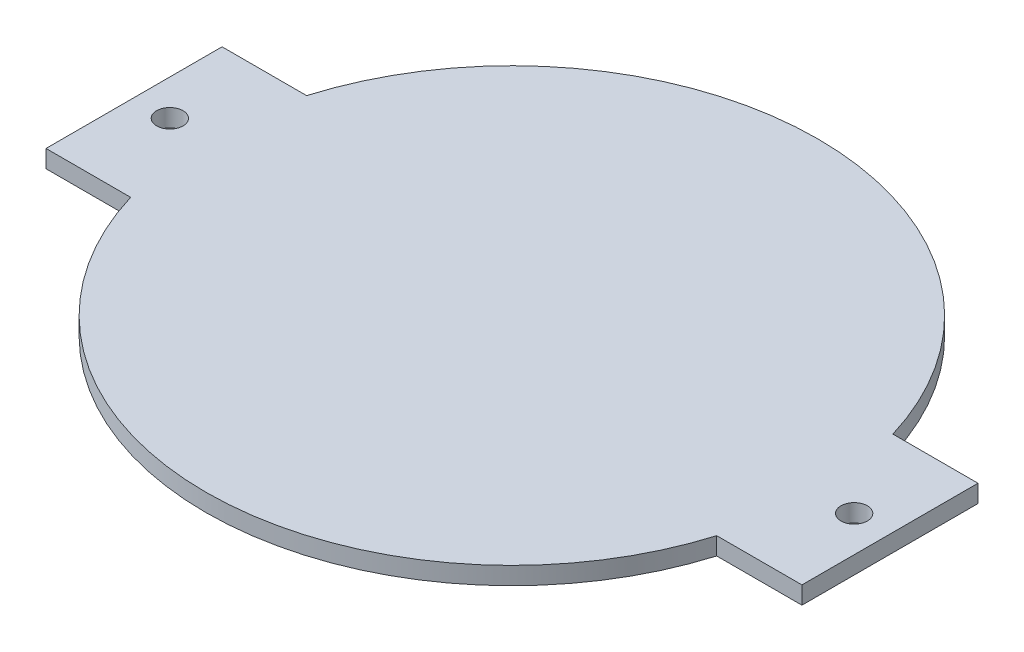
ISO-10303-21;
HEADER;
FILE_DESCRIPTION(('STEP AP214'),'2;1');
FILE_NAME('part.step','',(''),(''),'','','');
FILE_SCHEMA(('AUTOMOTIVE_DESIGN { 1 0 10303 214 1 1 1 1 }'));
ENDSEC;
DATA;
#1=APPLICATION_CONTEXT('core data for automotive mechanical design processes');
#2=APPLICATION_PROTOCOL_DEFINITION('international standard','automotive_design',2000,#1);
#3=PRODUCT_CONTEXT('',#1,'mechanical');
#4=PRODUCT('Part','Part','',(#3));
#5=PRODUCT_RELATED_PRODUCT_CATEGORY('part','',(#4));
#6=PRODUCT_DEFINITION_FORMATION('','',#4);
#7=PRODUCT_DEFINITION_CONTEXT('part definition',#1,'design');
#8=PRODUCT_DEFINITION('design','',#6,#7);
#9=PRODUCT_DEFINITION_SHAPE('','',#8);
#10=(LENGTH_UNIT() NAMED_UNIT(*) SI_UNIT(.MILLI.,.METRE.));
#11=(NAMED_UNIT(*) PLANE_ANGLE_UNIT() SI_UNIT($,.RADIAN.));
#12=(NAMED_UNIT(*) SI_UNIT($,.STERADIAN.) SOLID_ANGLE_UNIT());
#13=UNCERTAINTY_MEASURE_WITH_UNIT(LENGTH_MEASURE(1.E-05),#10,'distance_accuracy_value','');
#14=(GEOMETRIC_REPRESENTATION_CONTEXT(3) GLOBAL_UNCERTAINTY_ASSIGNED_CONTEXT((#13)) GLOBAL_UNIT_ASSIGNED_CONTEXT((#10,
#11,#12)) REPRESENTATION_CONTEXT('',''));
#15=CARTESIAN_POINT('',(0.,0.,0.));
#16=DIRECTION('',(0.,0.,1.));
#17=DIRECTION('',(1.,0.,0.));
#18=AXIS2_PLACEMENT_3D('',#15,#16,#17);
#19=CARTESIAN_POINT('',(-45.6397244959171,1.,1.53906899049078));
#20=DIRECTION('',(0.,1.,0.));
#21=DIRECTION('',(0.,0.,1.));
#22=AXIS2_PLACEMENT_3D('',#19,#20,#21);
#23=PLANE('',#22);
#24=CARTESIAN_POINT('',(-65.0556207330707,1.,1.54913489621494));
#25=DIRECTION('',(0.,1.,0.));
#26=DIRECTION('',(0.,0.,1.));
#27=AXIS2_PLACEMENT_3D('',#24,#25,#26);
#28=CIRCLE('',#27,0.750000000000009);
#29=CARTESIAN_POINT('',(-65.0556207330707,1.,2.29913489621495));
#30=VERTEX_POINT('',#29);
#31=EDGE_CURVE('E135',#30,#30,#28,.T.);
#32=ORIENTED_EDGE('',*,*,#31,.F.);
#33=EDGE_LOOP('',(#32));
#34=FACE_BOUND('',#33,.T.);
#35=DIRECTION('',(-1.,0.,0.));
#36=VECTOR('',#35,1.);
#37=CARTESIAN_POINT('',(-24.1541207330696,1.,-3.45086510379691));
#38=LINE('',#37,#36);
#39=CARTESIAN_POINT('',(-24.1541207330696,1.,-3.45086510379691));
#40=VERTEX_POINT('',#39);
#41=CARTESIAN_POINT('',(-28.98999498197,1.,-3.4508651037969));
#42=VERTEX_POINT('',#41);
#43=EDGE_CURVE('E146',#40,#42,#38,.T.);
#44=ORIENTED_EDGE('',*,*,#43,.T.);
#45=CARTESIAN_POINT('',(-45.6397244959171,1.,1.53906899049078));
#46=DIRECTION('',(0.,1.,0.));
#47=DIRECTION('',(0.,0.,1.));
#48=AXIS2_PLACEMENT_3D('',#45,#46,#47);
#49=CIRCLE('',#48,17.3813962371536);
#50=CARTESIAN_POINT('',(-62.2894540098678,1.,-3.45086510378506));
#51=VERTEX_POINT('',#50);
#52=EDGE_CURVE('E94',#42,#51,#49,.T.);
#53=ORIENTED_EDGE('',*,*,#52,.T.);
#54=DIRECTION('',(-1.,0.,0.));
#55=VECTOR('',#54,1.);
#56=CARTESIAN_POINT('',(-67.0901207330707,1.,-3.45086510378506));
#57=LINE('',#56,#55);
#58=CARTESIAN_POINT('',(-67.0901207330707,1.,-3.45086510378506));
#59=VERTEX_POINT('',#58);
#60=EDGE_CURVE('E161',#51,#59,#57,.T.);
#61=ORIENTED_EDGE('',*,*,#60,.T.);
#62=DIRECTION('',(0.,0.,1.));
#63=VECTOR('',#62,1.);
#64=CARTESIAN_POINT('',(-67.0901207330707,1.,-3.45086510378506));
#65=LINE('',#64,#63);
#66=CARTESIAN_POINT('',(-67.0901207330707,1.,6.54913489621494));
#67=VERTEX_POINT('',#66);
#68=EDGE_CURVE('E174',#59,#67,#65,.T.);
#69=ORIENTED_EDGE('',*,*,#68,.T.);
#70=DIRECTION('',(1.,0.,0.));
#71=VECTOR('',#70,1.);
#72=CARTESIAN_POINT('',(-67.0901207330707,1.,6.54913489621494));
#73=LINE('',#72,#71);
#74=CARTESIAN_POINT('',(-62.2834072246054,1.,6.54913489621494));
#75=VERTEX_POINT('',#74);
#76=EDGE_CURVE('E113',#67,#75,#73,.T.);
#77=ORIENTED_EDGE('',*,*,#76,.T.);
#78=CARTESIAN_POINT('',(-45.6397244959171,1.,1.53906899049078));
#79=DIRECTION('',(0.,1.,0.));
#80=DIRECTION('',(0.,0.,1.));
#81=AXIS2_PLACEMENT_3D('',#78,#79,#80);
#82=CIRCLE('',#81,17.3813962371536);
#83=CARTESIAN_POINT('',(-28.9960417672253,1.,6.5491348962031));
#84=VERTEX_POINT('',#83);
#85=EDGE_CURVE('E107',#75,#84,#82,.T.);
#86=ORIENTED_EDGE('',*,*,#85,.T.);
#87=DIRECTION('',(1.,0.,0.));
#88=VECTOR('',#87,1.);
#89=CARTESIAN_POINT('',(-24.1541207330696,1.,6.5491348962031));
#90=LINE('',#89,#88);
#91=CARTESIAN_POINT('',(-24.1541207330696,1.,6.5491348962031));
#92=VERTEX_POINT('',#91);
#93=EDGE_CURVE('E111',#84,#92,#90,.T.);
#94=ORIENTED_EDGE('',*,*,#93,.T.);
#95=DIRECTION('',(0.,0.,-1.));
#96=VECTOR('',#95,1.);
#97=CARTESIAN_POINT('',(-24.1541207330696,1.,-3.45086510379691));
#98=LINE('',#97,#96);
#99=EDGE_CURVE('E51',#92,#40,#98,.T.);
#100=ORIENTED_EDGE('',*,*,#99,.T.);
#101=EDGE_LOOP('',(#44,#53,#61,#69,#77,#86,#94,#100));
#102=FACE_BOUND('',#101,.T.);
#103=CARTESIAN_POINT('',(-26.1886207330696,1.,1.54913489620309));
#104=DIRECTION('',(0.,1.,0.));
#105=DIRECTION('',(0.,0.,1.));
#106=AXIS2_PLACEMENT_3D('',#103,#104,#105);
#107=CIRCLE('',#106,0.749999999999996);
#108=CARTESIAN_POINT('',(-26.1886207330696,1.,2.29913489620309));
#109=VERTEX_POINT('',#108);
#110=EDGE_CURVE('E183',#109,#109,#107,.T.);
#111=ORIENTED_EDGE('',*,*,#110,.F.);
#112=EDGE_LOOP('',(#111));
#113=FACE_BOUND('',#112,.T.);
#114=ADVANCED_FACE('F34',(#34,#102,#113),#23,.T.);
#115=CARTESIAN_POINT('',(-45.6397244959171,0.,1.53906899049078));
#116=DIRECTION('',(0.,1.,0.));
#117=DIRECTION('',(0.,0.,1.));
#118=AXIS2_PLACEMENT_3D('',#115,#116,#117);
#119=PLANE('',#118);
#120=CARTESIAN_POINT('',(-65.0556207330707,0.,1.54913489621494));
#121=DIRECTION('',(0.,1.,0.));
#122=DIRECTION('',(0.,0.,1.));
#123=AXIS2_PLACEMENT_3D('',#120,#121,#122);
#124=CIRCLE('',#123,0.750000000000009);
#125=CARTESIAN_POINT('',(-65.0556207330707,0.,2.29913489621495));
#126=VERTEX_POINT('',#125);
#127=EDGE_CURVE('E180',#126,#126,#124,.T.);
#128=ORIENTED_EDGE('',*,*,#127,.T.);
#129=EDGE_LOOP('',(#128));
#130=FACE_BOUND('',#129,.T.);
#131=DIRECTION('',(-1.,0.,0.));
#132=VECTOR('',#131,1.);
#133=CARTESIAN_POINT('',(-24.1541207330696,0.,-3.45086510379691));
#134=LINE('',#133,#132);
#135=CARTESIAN_POINT('',(-24.1541207330696,0.,-3.45086510379691));
#136=VERTEX_POINT('',#135);
#137=CARTESIAN_POINT('',(-28.98999498197,0.,-3.4508651037969));
#138=VERTEX_POINT('',#137);
#139=EDGE_CURVE('E131',#136,#138,#134,.T.);
#140=ORIENTED_EDGE('',*,*,#139,.F.);
#141=DIRECTION('',(0.,0.,-1.));
#142=VECTOR('',#141,1.);
#143=CARTESIAN_POINT('',(-24.1541207330696,0.,-3.45086510379691));
#144=LINE('',#143,#142);
#145=CARTESIAN_POINT('',(-24.1541207330696,0.,6.5491348962031));
#146=VERTEX_POINT('',#145);
#147=EDGE_CURVE('E86',#146,#136,#144,.T.);
#148=ORIENTED_EDGE('',*,*,#147,.F.);
#149=DIRECTION('',(1.,0.,0.));
#150=VECTOR('',#149,1.);
#151=CARTESIAN_POINT('',(-24.1541207330696,0.,6.5491348962031));
#152=LINE('',#151,#150);
#153=CARTESIAN_POINT('',(-28.9960417672253,0.,6.5491348962031));
#154=VERTEX_POINT('',#153);
#155=EDGE_CURVE('E80',#154,#146,#152,.T.);
#156=ORIENTED_EDGE('',*,*,#155,.F.);
#157=CARTESIAN_POINT('',(-45.6397244959171,0.,1.53906899049078));
#158=DIRECTION('',(0.,1.,0.));
#159=DIRECTION('',(0.,0.,1.));
#160=AXIS2_PLACEMENT_3D('',#157,#158,#159);
#161=CIRCLE('',#160,17.3813962371536);
#162=CARTESIAN_POINT('',(-62.2834072246054,0.,6.54913489621494));
#163=VERTEX_POINT('',#162);
#164=EDGE_CURVE('E121',#163,#154,#161,.T.);
#165=ORIENTED_EDGE('',*,*,#164,.F.);
#166=DIRECTION('',(1.,0.,0.));
#167=VECTOR('',#166,1.);
#168=CARTESIAN_POINT('',(-67.0901207330707,0.,6.54913489621494));
#169=LINE('',#168,#167);
#170=CARTESIAN_POINT('',(-67.0901207330707,0.,6.54913489621494));
#171=VERTEX_POINT('',#170);
#172=EDGE_CURVE('E141',#171,#163,#169,.T.);
#173=ORIENTED_EDGE('',*,*,#172,.F.);
#174=DIRECTION('',(0.,0.,1.));
#175=VECTOR('',#174,1.);
#176=CARTESIAN_POINT('',(-67.0901207330707,0.,-3.45086510378506));
#177=LINE('',#176,#175);
#178=CARTESIAN_POINT('',(-67.0901207330707,0.,-3.45086510378506));
#179=VERTEX_POINT('',#178);
#180=EDGE_CURVE('E139',#179,#171,#177,.T.);
#181=ORIENTED_EDGE('',*,*,#180,.F.);
#182=DIRECTION('',(-1.,0.,0.));
#183=VECTOR('',#182,1.);
#184=CARTESIAN_POINT('',(-67.0901207330707,0.,-3.45086510378506));
#185=LINE('',#184,#183);
#186=CARTESIAN_POINT('',(-62.2894540098678,0.,-3.45086510378506));
#187=VERTEX_POINT('',#186);
#188=EDGE_CURVE('E137',#187,#179,#185,.T.);
#189=ORIENTED_EDGE('',*,*,#188,.F.);
#190=CARTESIAN_POINT('',(-45.6397244959171,0.,1.53906899049078));
#191=DIRECTION('',(0.,1.,0.));
#192=DIRECTION('',(0.,0.,1.));
#193=AXIS2_PLACEMENT_3D('',#190,#191,#192);
#194=CIRCLE('',#193,17.3813962371536);
#195=EDGE_CURVE('E134',#138,#187,#194,.T.);
#196=ORIENTED_EDGE('',*,*,#195,.F.);
#197=EDGE_LOOP('',(#140,#148,#156,#165,#173,#181,#189,#196));
#198=FACE_BOUND('',#197,.T.);
#199=CARTESIAN_POINT('',(-26.1886207330696,0.,1.54913489620309));
#200=DIRECTION('',(0.,1.,0.));
#201=DIRECTION('',(0.,0.,1.));
#202=AXIS2_PLACEMENT_3D('',#199,#200,#201);
#203=CIRCLE('',#202,0.749999999999996);
#204=CARTESIAN_POINT('',(-26.1886207330696,0.,2.29913489620309));
#205=VERTEX_POINT('',#204);
#206=EDGE_CURVE('E186',#205,#205,#203,.T.);
#207=ORIENTED_EDGE('',*,*,#206,.T.);
#208=EDGE_LOOP('',(#207));
#209=FACE_BOUND('',#208,.T.);
#210=ADVANCED_FACE('F165',(#130,#198,#209),#119,.F.);
#211=CARTESIAN_POINT('',(-24.1541207330696,1.,-3.45086510379691));
#212=DIRECTION('',(0.,0.,1.));
#213=DIRECTION('',(1.,0.,0.));
#214=AXIS2_PLACEMENT_3D('',#211,#212,#213);
#215=PLANE('',#214);
#216=ORIENTED_EDGE('',*,*,#139,.T.);
#217=DIRECTION('',(0.,-1.,0.));
#218=VECTOR('',#217,1.);
#219=CARTESIAN_POINT('',(-28.98999498197,1.,-3.4508651037969));
#220=LINE('',#219,#218);
#221=EDGE_CURVE('E11',#42,#138,#220,.T.);
#222=ORIENTED_EDGE('',*,*,#221,.F.);
#223=ORIENTED_EDGE('',*,*,#43,.F.);
#224=DIRECTION('',(0.,-1.,0.));
#225=VECTOR('',#224,1.);
#226=CARTESIAN_POINT('',(-24.1541207330696,1.,-3.45086510379691));
#227=LINE('',#226,#225);
#228=EDGE_CURVE('E127',#40,#136,#227,.T.);
#229=ORIENTED_EDGE('',*,*,#228,.T.);
#230=EDGE_LOOP('',(#216,#222,#223,#229));
#231=FACE_BOUND('',#230,.T.);
#232=ADVANCED_FACE('F36',(#231),#215,.F.);
#233=CARTESIAN_POINT('',(-45.6397244959171,1.,1.53906899049078));
#234=DIRECTION('',(0.,-1.,0.));
#235=DIRECTION('',(0.,0.,-1.));
#236=AXIS2_PLACEMENT_3D('',#233,#234,#235);
#237=CYLINDRICAL_SURFACE('',#236,17.3813962371536);
#238=ORIENTED_EDGE('',*,*,#195,.T.);
#239=DIRECTION('',(0.,-1.,0.));
#240=VECTOR('',#239,1.);
#241=CARTESIAN_POINT('',(-62.2894540098678,1.,-3.45086510378506));
#242=LINE('',#241,#240);
#243=EDGE_CURVE('E43',#51,#187,#242,.T.);
#244=ORIENTED_EDGE('',*,*,#243,.F.);
#245=ORIENTED_EDGE('',*,*,#52,.F.);
#246=ORIENTED_EDGE('',*,*,#221,.T.);
#247=EDGE_LOOP('',(#238,#244,#245,#246));
#248=FACE_BOUND('',#247,.T.);
#249=ADVANCED_FACE('F219',(#248),#237,.T.);
#250=CARTESIAN_POINT('',(-67.0901207330707,1.,-3.45086510378506));
#251=DIRECTION('',(0.,0.,1.));
#252=DIRECTION('',(1.,0.,0.));
#253=AXIS2_PLACEMENT_3D('',#250,#251,#252);
#254=PLANE('',#253);
#255=ORIENTED_EDGE('',*,*,#188,.T.);
#256=DIRECTION('',(0.,-1.,0.));
#257=VECTOR('',#256,1.);
#258=CARTESIAN_POINT('',(-67.0901207330707,1.,-3.45086510378506));
#259=LINE('',#258,#257);
#260=EDGE_CURVE('E153',#59,#179,#259,.T.);
#261=ORIENTED_EDGE('',*,*,#260,.F.);
#262=ORIENTED_EDGE('',*,*,#60,.F.);
#263=ORIENTED_EDGE('',*,*,#243,.T.);
#264=EDGE_LOOP('',(#255,#261,#262,#263));
#265=FACE_BOUND('',#264,.T.);
#266=ADVANCED_FACE('F159',(#265),#254,.F.);
#267=CARTESIAN_POINT('',(-67.0901207330707,1.,-3.45086510378506));
#268=DIRECTION('',(1.,0.,0.));
#269=DIRECTION('',(0.,0.,-1.));
#270=AXIS2_PLACEMENT_3D('',#267,#268,#269);
#271=PLANE('',#270);
#272=ORIENTED_EDGE('',*,*,#180,.T.);
#273=DIRECTION('',(0.,-1.,0.));
#274=VECTOR('',#273,1.);
#275=CARTESIAN_POINT('',(-67.0901207330707,1.,6.54913489621494));
#276=LINE('',#275,#274);
#277=EDGE_CURVE('E150',#67,#171,#276,.T.);
#278=ORIENTED_EDGE('',*,*,#277,.F.);
#279=ORIENTED_EDGE('',*,*,#68,.F.);
#280=ORIENTED_EDGE('',*,*,#260,.T.);
#281=EDGE_LOOP('',(#272,#278,#279,#280));
#282=FACE_BOUND('',#281,.T.);
#283=ADVANCED_FACE('F170',(#282),#271,.F.);
#284=CARTESIAN_POINT('',(-67.0901207330707,1.,6.54913489621494));
#285=DIRECTION('',(0.,0.,-1.));
#286=DIRECTION('',(-1.,0.,0.));
#287=AXIS2_PLACEMENT_3D('',#284,#285,#286);
#288=PLANE('',#287);
#289=ORIENTED_EDGE('',*,*,#172,.T.);
#290=DIRECTION('',(0.,-1.,0.));
#291=VECTOR('',#290,1.);
#292=CARTESIAN_POINT('',(-62.2834072246054,1.,6.54913489621494));
#293=LINE('',#292,#291);
#294=EDGE_CURVE('E122',#75,#163,#293,.T.);
#295=ORIENTED_EDGE('',*,*,#294,.F.);
#296=ORIENTED_EDGE('',*,*,#76,.F.);
#297=ORIENTED_EDGE('',*,*,#277,.T.);
#298=EDGE_LOOP('',(#289,#295,#296,#297));
#299=FACE_BOUND('',#298,.T.);
#300=ADVANCED_FACE('F173',(#299),#288,.F.);
#301=CARTESIAN_POINT('',(-45.6397244959171,1.,1.53906899049078));
#302=DIRECTION('',(0.,-1.,0.));
#303=DIRECTION('',(0.,0.,-1.));
#304=AXIS2_PLACEMENT_3D('',#301,#302,#303);
#305=CYLINDRICAL_SURFACE('',#304,17.3813962371536);
#306=ORIENTED_EDGE('',*,*,#164,.T.);
#307=DIRECTION('',(0.,-1.,0.));
#308=VECTOR('',#307,1.);
#309=CARTESIAN_POINT('',(-28.9960417672253,1.,6.5491348962031));
#310=LINE('',#309,#308);
#311=EDGE_CURVE('E118',#84,#154,#310,.T.);
#312=ORIENTED_EDGE('',*,*,#311,.F.);
#313=ORIENTED_EDGE('',*,*,#85,.F.);
#314=ORIENTED_EDGE('',*,*,#294,.T.);
#315=EDGE_LOOP('',(#306,#312,#313,#314));
#316=FACE_BOUND('',#315,.T.);
#317=ADVANCED_FACE('F119',(#316),#305,.T.);
#318=CARTESIAN_POINT('',(-24.1541207330696,1.,6.5491348962031));
#319=DIRECTION('',(0.,0.,-1.));
#320=DIRECTION('',(-1.,0.,0.));
#321=AXIS2_PLACEMENT_3D('',#318,#319,#320);
#322=PLANE('',#321);
#323=ORIENTED_EDGE('',*,*,#155,.T.);
#324=DIRECTION('',(0.,-1.,0.));
#325=VECTOR('',#324,1.);
#326=CARTESIAN_POINT('',(-24.1541207330696,1.,6.5491348962031));
#327=LINE('',#326,#325);
#328=EDGE_CURVE('E123',#92,#146,#327,.T.);
#329=ORIENTED_EDGE('',*,*,#328,.F.);
#330=ORIENTED_EDGE('',*,*,#93,.F.);
#331=ORIENTED_EDGE('',*,*,#311,.T.);
#332=EDGE_LOOP('',(#323,#329,#330,#331));
#333=FACE_BOUND('',#332,.T.);
#334=ADVANCED_FACE('F125',(#333),#322,.F.);
#335=CARTESIAN_POINT('',(-24.1541207330696,1.,-3.45086510379691));
#336=DIRECTION('',(-1.,0.,0.));
#337=DIRECTION('',(0.,0.,1.));
#338=AXIS2_PLACEMENT_3D('',#335,#336,#337);
#339=PLANE('',#338);
#340=ORIENTED_EDGE('',*,*,#147,.T.);
#341=ORIENTED_EDGE('',*,*,#228,.F.);
#342=ORIENTED_EDGE('',*,*,#99,.F.);
#343=ORIENTED_EDGE('',*,*,#328,.T.);
#344=EDGE_LOOP('',(#340,#341,#342,#343));
#345=FACE_BOUND('',#344,.T.);
#346=ADVANCED_FACE('F207',(#345),#339,.F.);
#347=CARTESIAN_POINT('',(-65.0556207330707,1.,1.54913489621494));
#348=DIRECTION('',(0.,-1.,0.));
#349=DIRECTION('',(0.,0.,-1.));
#350=AXIS2_PLACEMENT_3D('',#347,#348,#349);
#351=CYLINDRICAL_SURFACE('',#350,0.750000000000009);
#352=ORIENTED_EDGE('',*,*,#31,.T.);
#353=EDGE_LOOP('',(#352));
#354=FACE_BOUND('',#353,.T.);
#355=ORIENTED_EDGE('',*,*,#127,.F.);
#356=EDGE_LOOP('',(#355));
#357=FACE_BOUND('',#356,.T.);
#358=ADVANCED_FACE('F204',(#354,#357),#351,.F.);
#359=CARTESIAN_POINT('',(-26.1886207330696,1.,1.54913489620309));
#360=DIRECTION('',(0.,-1.,0.));
#361=DIRECTION('',(0.,0.,-1.));
#362=AXIS2_PLACEMENT_3D('',#359,#360,#361);
#363=CYLINDRICAL_SURFACE('',#362,0.749999999999996);
#364=ORIENTED_EDGE('',*,*,#110,.T.);
#365=EDGE_LOOP('',(#364));
#366=FACE_BOUND('',#365,.T.);
#367=ORIENTED_EDGE('',*,*,#206,.F.);
#368=EDGE_LOOP('',(#367));
#369=FACE_BOUND('',#368,.T.);
#370=ADVANCED_FACE('F192',(#366,#369),#363,.F.);
#371=CLOSED_SHELL('',(#114,#210,#232,#249,#266,#283,#300,#317,#334,#346,#358,#370));
#372=MANIFOLD_SOLID_BREP('B2',#371);
#373=ADVANCED_BREP_SHAPE_REPRESENTATION('',(#18,#372),#14);
#374=SHAPE_DEFINITION_REPRESENTATION(#9,#373);
ENDSEC;
END-ISO-10303-21;
